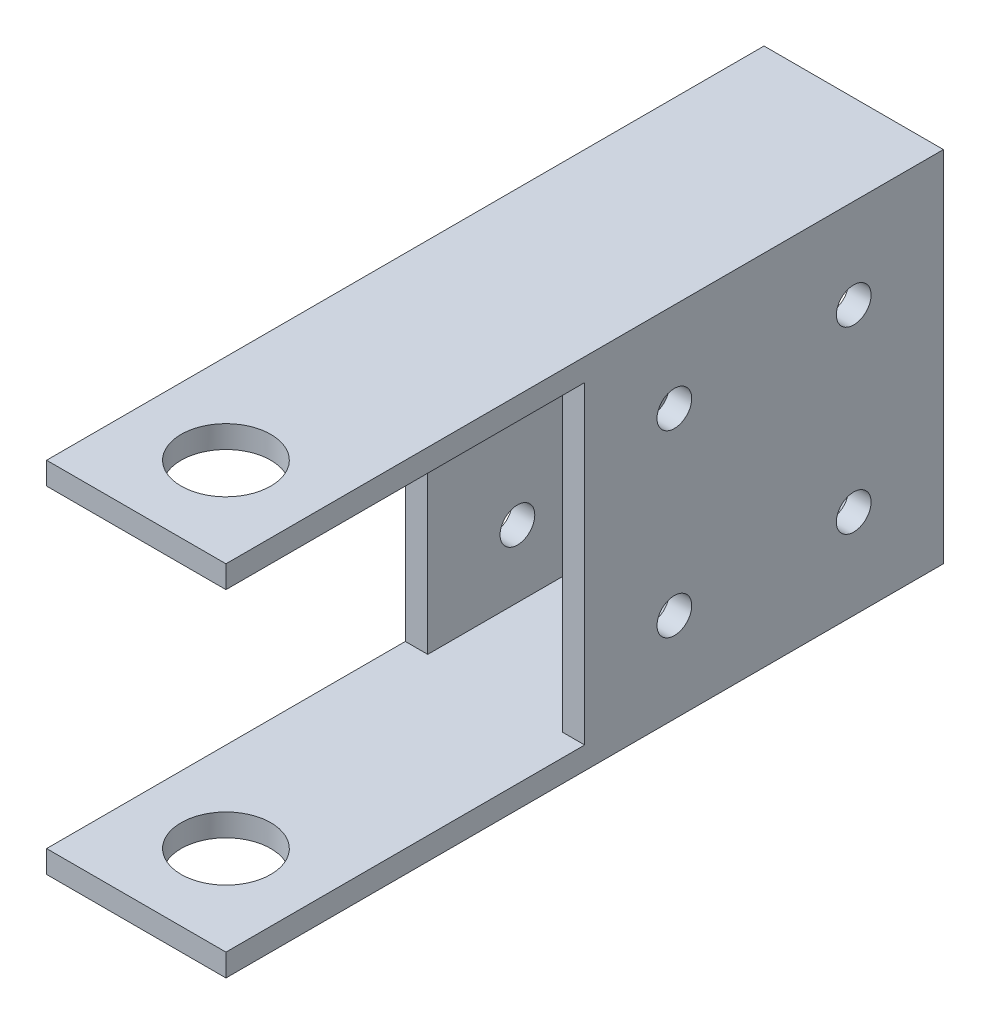
ISO-10303-21;
HEADER;
FILE_DESCRIPTION(('STEP AP214'),'2;1');
FILE_NAME('part.step','',(''),(''),'','','');
FILE_SCHEMA(('AUTOMOTIVE_DESIGN { 1 0 10303 214 1 1 1 1 }'));
ENDSEC;
DATA;
#1=APPLICATION_CONTEXT('core data for automotive mechanical design processes');
#2=APPLICATION_PROTOCOL_DEFINITION('international standard','automotive_design',2000,#1);
#3=PRODUCT_CONTEXT('',#1,'mechanical');
#4=PRODUCT('Part','Part','',(#3));
#5=PRODUCT_RELATED_PRODUCT_CATEGORY('part','',(#4));
#6=PRODUCT_DEFINITION_FORMATION('','',#4);
#7=PRODUCT_DEFINITION_CONTEXT('part definition',#1,'design');
#8=PRODUCT_DEFINITION('design','',#6,#7);
#9=PRODUCT_DEFINITION_SHAPE('','',#8);
#10=(LENGTH_UNIT() NAMED_UNIT(*) SI_UNIT(.MILLI.,.METRE.));
#11=(NAMED_UNIT(*) PLANE_ANGLE_UNIT() SI_UNIT($,.RADIAN.));
#12=(NAMED_UNIT(*) SI_UNIT($,.STERADIAN.) SOLID_ANGLE_UNIT());
#13=UNCERTAINTY_MEASURE_WITH_UNIT(LENGTH_MEASURE(1.E-05),#10,'distance_accuracy_value','');
#14=(GEOMETRIC_REPRESENTATION_CONTEXT(3) GLOBAL_UNCERTAINTY_ASSIGNED_CONTEXT((#13)) GLOBAL_UNIT_ASSIGNED_CONTEXT((#10,
#11,#12)) REPRESENTATION_CONTEXT('',''));
#15=CARTESIAN_POINT('',(0.,0.,0.));
#16=DIRECTION('',(0.,0.,1.));
#17=DIRECTION('',(1.,0.,0.));
#18=AXIS2_PLACEMENT_3D('',#15,#16,#17);
#19=CARTESIAN_POINT('',(-12.7,-22.225,0.));
#20=DIRECTION('',(0.,0.,-1.));
#21=DIRECTION('',(-1.,0.,0.));
#22=AXIS2_PLACEMENT_3D('',#19,#20,#21);
#23=PLANE('',#22);
#24=DIRECTION('',(1.,0.,0.));
#25=VECTOR('',#24,1.);
#26=CARTESIAN_POINT('',(-12.7,-22.225,0.));
#27=LINE('',#26,#25);
#28=CARTESIAN_POINT('',(-12.7,-22.225,0.));
#29=VERTEX_POINT('',#28);
#30=CARTESIAN_POINT('',(-9.525,-22.225,0.));
#31=VERTEX_POINT('',#30);
#32=EDGE_CURVE('E229',#29,#31,#27,.T.);
#33=ORIENTED_EDGE('',*,*,#32,.T.);
#34=DIRECTION('',(0.,1.,0.));
#35=VECTOR('',#34,1.);
#36=CARTESIAN_POINT('',(-9.525,-22.225,0.));
#37=LINE('',#36,#35);
#38=CARTESIAN_POINT('',(-9.52500000000001,22.225,0.));
#39=VERTEX_POINT('',#38);
#40=EDGE_CURVE('E174',#31,#39,#37,.T.);
#41=ORIENTED_EDGE('',*,*,#40,.T.);
#42=DIRECTION('',(1.,0.,0.));
#43=VECTOR('',#42,1.);
#44=CARTESIAN_POINT('',(-12.7,22.225,0.));
#45=LINE('',#44,#43);
#46=CARTESIAN_POINT('',(-12.7,22.225,0.));
#47=VERTEX_POINT('',#46);
#48=EDGE_CURVE('E237',#47,#39,#45,.T.);
#49=ORIENTED_EDGE('',*,*,#48,.F.);
#50=DIRECTION('',(0.,1.,0.));
#51=VECTOR('',#50,1.);
#52=CARTESIAN_POINT('',(-12.7,-22.225,0.));
#53=LINE('',#52,#51);
#54=EDGE_CURVE('E212',#29,#47,#53,.T.);
#55=ORIENTED_EDGE('',*,*,#54,.F.);
#56=EDGE_LOOP('',(#33,#41,#49,#55));
#57=FACE_BOUND('',#56,.T.);
#58=ADVANCED_FACE('F33',(#57),#23,.F.);
#59=CARTESIAN_POINT('',(12.7,-12.7,-38.1));
#60=DIRECTION('',(1.,0.,0.));
#61=DIRECTION('',(0.,0.,-1.));
#62=AXIS2_PLACEMENT_3D('',#59,#60,#61);
#63=CYLINDRICAL_SURFACE('',#62,2.45744999999999);
#64=CARTESIAN_POINT('',(-9.525,-12.7,-38.1));
#65=DIRECTION('',(-1.,0.,0.));
#66=DIRECTION('',(0.,-1.,0.));
#67=AXIS2_PLACEMENT_3D('',#64,#65,#66);
#68=CIRCLE('',#67,2.45744999999999);
#69=CARTESIAN_POINT('',(-9.525,-15.15745,-38.1));
#70=VERTEX_POINT('',#69);
#71=EDGE_CURVE('E171',#70,#70,#68,.F.);
#72=ORIENTED_EDGE('',*,*,#71,.T.);
#73=EDGE_LOOP('',(#72));
#74=FACE_BOUND('',#73,.T.);
#75=CARTESIAN_POINT('',(-12.7,-12.7,-38.1));
#76=DIRECTION('',(1.,0.,0.));
#77=DIRECTION('',(0.,0.,-1.));
#78=AXIS2_PLACEMENT_3D('',#75,#76,#77);
#79=CIRCLE('',#78,2.45744999999999);
#80=CARTESIAN_POINT('',(-12.7,-12.7,-40.55745));
#81=VERTEX_POINT('',#80);
#82=EDGE_CURVE('E198',#81,#81,#79,.T.);
#83=ORIENTED_EDGE('',*,*,#82,.F.);
#84=EDGE_LOOP('',(#83));
#85=FACE_BOUND('',#84,.T.);
#86=ADVANCED_FACE('F345',(#74,#85),#63,.F.);
#87=CARTESIAN_POINT('',(12.7,-12.7,-12.7));
#88=DIRECTION('',(1.,0.,0.));
#89=DIRECTION('',(0.,0.,-1.));
#90=AXIS2_PLACEMENT_3D('',#87,#88,#89);
#91=CYLINDRICAL_SURFACE('',#90,2.45744999999999);
#92=CARTESIAN_POINT('',(-9.525,-12.7,-12.7));
#93=DIRECTION('',(-1.,0.,0.));
#94=DIRECTION('',(0.,-1.,0.));
#95=AXIS2_PLACEMENT_3D('',#92,#93,#94);
#96=CIRCLE('',#95,2.45744999999999);
#97=CARTESIAN_POINT('',(-9.525,-15.15745,-12.7));
#98=VERTEX_POINT('',#97);
#99=EDGE_CURVE('E168',#98,#98,#96,.F.);
#100=ORIENTED_EDGE('',*,*,#99,.T.);
#101=EDGE_LOOP('',(#100));
#102=FACE_BOUND('',#101,.T.);
#103=CARTESIAN_POINT('',(-12.7,-12.7,-12.7));
#104=DIRECTION('',(1.,0.,0.));
#105=DIRECTION('',(0.,0.,-1.));
#106=AXIS2_PLACEMENT_3D('',#103,#104,#105);
#107=CIRCLE('',#106,2.45744999999999);
#108=CARTESIAN_POINT('',(-12.7,-12.7,-15.15745));
#109=VERTEX_POINT('',#108);
#110=EDGE_CURVE('E192',#109,#109,#107,.T.);
#111=ORIENTED_EDGE('',*,*,#110,.F.);
#112=EDGE_LOOP('',(#111));
#113=FACE_BOUND('',#112,.T.);
#114=ADVANCED_FACE('F288',(#102,#113),#91,.F.);
#115=CARTESIAN_POINT('',(12.7,12.7,-38.1));
#116=DIRECTION('',(1.,0.,0.));
#117=DIRECTION('',(0.,0.,-1.));
#118=AXIS2_PLACEMENT_3D('',#115,#116,#117);
#119=CYLINDRICAL_SURFACE('',#118,2.45744999999999);
#120=CARTESIAN_POINT('',(-9.52500000000001,12.7,-38.1));
#121=DIRECTION('',(-1.,0.,0.));
#122=DIRECTION('',(0.,-1.,0.));
#123=AXIS2_PLACEMENT_3D('',#120,#121,#122);
#124=CIRCLE('',#123,2.45744999999999);
#125=CARTESIAN_POINT('',(-9.52500000000001,10.24255,-38.1));
#126=VERTEX_POINT('',#125);
#127=EDGE_CURVE('E165',#126,#126,#124,.F.);
#128=ORIENTED_EDGE('',*,*,#127,.T.);
#129=EDGE_LOOP('',(#128));
#130=FACE_BOUND('',#129,.T.);
#131=CARTESIAN_POINT('',(-12.7,12.7,-38.1));
#132=DIRECTION('',(1.,0.,0.));
#133=DIRECTION('',(0.,0.,-1.));
#134=AXIS2_PLACEMENT_3D('',#131,#132,#133);
#135=CIRCLE('',#134,2.45744999999999);
#136=CARTESIAN_POINT('',(-12.7,12.7,-40.55745));
#137=VERTEX_POINT('',#136);
#138=EDGE_CURVE('E186',#137,#137,#135,.T.);
#139=ORIENTED_EDGE('',*,*,#138,.F.);
#140=EDGE_LOOP('',(#139));
#141=FACE_BOUND('',#140,.T.);
#142=ADVANCED_FACE('F442',(#130,#141),#119,.F.);
#143=CARTESIAN_POINT('',(12.7,12.7,-12.7));
#144=DIRECTION('',(1.,0.,0.));
#145=DIRECTION('',(0.,0.,-1.));
#146=AXIS2_PLACEMENT_3D('',#143,#144,#145);
#147=CYLINDRICAL_SURFACE('',#146,2.45744999999999);
#148=CARTESIAN_POINT('',(-9.52500000000001,12.7,-12.7));
#149=DIRECTION('',(-1.,0.,0.));
#150=DIRECTION('',(0.,-1.,0.));
#151=AXIS2_PLACEMENT_3D('',#148,#149,#150);
#152=CIRCLE('',#151,2.45744999999999);
#153=CARTESIAN_POINT('',(-9.52500000000001,10.24255,-12.7));
#154=VERTEX_POINT('',#153);
#155=EDGE_CURVE('E37',#154,#154,#152,.F.);
#156=ORIENTED_EDGE('',*,*,#155,.T.);
#157=EDGE_LOOP('',(#156));
#158=FACE_BOUND('',#157,.T.);
#159=CARTESIAN_POINT('',(-12.7,12.7,-12.7));
#160=DIRECTION('',(1.,0.,0.));
#161=DIRECTION('',(0.,0.,-1.));
#162=AXIS2_PLACEMENT_3D('',#159,#160,#161);
#163=CIRCLE('',#162,2.45744999999999);
#164=CARTESIAN_POINT('',(-12.7,12.7,-15.15745));
#165=VERTEX_POINT('',#164);
#166=EDGE_CURVE('E180',#165,#165,#163,.T.);
#167=ORIENTED_EDGE('',*,*,#166,.F.);
#168=EDGE_LOOP('',(#167));
#169=FACE_BOUND('',#168,.T.);
#170=ADVANCED_FACE('F451',(#158,#169),#147,.F.);
#171=CARTESIAN_POINT('',(0.,0.,50.8));
#172=DIRECTION('',(0.,0.,1.));
#173=DIRECTION('',(1.,0.,0.));
#174=AXIS2_PLACEMENT_3D('',#171,#172,#173);
#175=PLANE('',#174);
#176=DIRECTION('',(1.,0.,0.));
#177=VECTOR('',#176,1.);
#178=CARTESIAN_POINT('',(-12.7,-22.225,50.8));
#179=LINE('',#178,#177);
#180=CARTESIAN_POINT('',(-12.7,-22.225,50.8));
#181=VERTEX_POINT('',#180);
#182=CARTESIAN_POINT('',(12.7,-22.225,50.8));
#183=VERTEX_POINT('',#182);
#184=EDGE_CURVE('E233',#181,#183,#179,.T.);
#185=ORIENTED_EDGE('',*,*,#184,.F.);
#186=DIRECTION('',(0.,-1.,0.));
#187=VECTOR('',#186,1.);
#188=CARTESIAN_POINT('',(-12.7,25.4,50.8));
#189=LINE('',#188,#187);
#190=CARTESIAN_POINT('',(-12.7,-25.4,50.8));
#191=VERTEX_POINT('',#190);
#192=EDGE_CURVE('E246',#181,#191,#189,.T.);
#193=ORIENTED_EDGE('',*,*,#192,.T.);
#194=DIRECTION('',(1.,0.,0.));
#195=VECTOR('',#194,1.);
#196=CARTESIAN_POINT('',(-12.7,-25.4,50.8));
#197=LINE('',#196,#195);
#198=CARTESIAN_POINT('',(12.7,-25.4,50.8));
#199=VERTEX_POINT('',#198);
#200=EDGE_CURVE('E250',#191,#199,#197,.T.);
#201=ORIENTED_EDGE('',*,*,#200,.T.);
#202=DIRECTION('',(0.,1.,0.));
#203=VECTOR('',#202,1.);
#204=CARTESIAN_POINT('',(12.7,25.4,50.8));
#205=LINE('',#204,#203);
#206=EDGE_CURVE('E240',#199,#183,#205,.T.);
#207=ORIENTED_EDGE('',*,*,#206,.T.);
#208=EDGE_LOOP('',(#185,#193,#201,#207));
#209=FACE_BOUND('',#208,.T.);
#210=ADVANCED_FACE('F294',(#209),#175,.T.);
#211=CARTESIAN_POINT('',(12.7,25.4,50.8));
#212=DIRECTION('',(-1.,0.,0.));
#213=DIRECTION('',(0.,-1.,0.));
#214=AXIS2_PLACEMENT_3D('',#211,#212,#213);
#215=PLANE('',#214);
#216=CARTESIAN_POINT('',(12.7,12.7,-12.7));
#217=DIRECTION('',(1.,0.,0.));
#218=DIRECTION('',(0.,0.,-1.));
#219=AXIS2_PLACEMENT_3D('',#216,#217,#218);
#220=CIRCLE('',#219,2.45744999999999);
#221=CARTESIAN_POINT('',(12.7,12.7,-15.15745));
#222=VERTEX_POINT('',#221);
#223=EDGE_CURVE('E177',#222,#222,#220,.T.);
#224=ORIENTED_EDGE('',*,*,#223,.F.);
#225=EDGE_LOOP('',(#224));
#226=FACE_BOUND('',#225,.T.);
#227=CARTESIAN_POINT('',(12.7,12.7,-38.1));
#228=DIRECTION('',(1.,0.,0.));
#229=DIRECTION('',(0.,0.,-1.));
#230=AXIS2_PLACEMENT_3D('',#227,#228,#229);
#231=CIRCLE('',#230,2.45744999999999);
#232=CARTESIAN_POINT('',(12.7,12.7,-40.55745));
#233=VERTEX_POINT('',#232);
#234=EDGE_CURVE('E183',#233,#233,#231,.T.);
#235=ORIENTED_EDGE('',*,*,#234,.F.);
#236=EDGE_LOOP('',(#235));
#237=FACE_BOUND('',#236,.T.);
#238=CARTESIAN_POINT('',(12.7,-12.7,-12.7));
#239=DIRECTION('',(1.,0.,0.));
#240=DIRECTION('',(0.,0.,-1.));
#241=AXIS2_PLACEMENT_3D('',#238,#239,#240);
#242=CIRCLE('',#241,2.45744999999999);
#243=CARTESIAN_POINT('',(12.7,-12.7,-15.15745));
#244=VERTEX_POINT('',#243);
#245=EDGE_CURVE('E189',#244,#244,#242,.T.);
#246=ORIENTED_EDGE('',*,*,#245,.F.);
#247=EDGE_LOOP('',(#246));
#248=FACE_BOUND('',#247,.T.);
#249=CARTESIAN_POINT('',(12.7,-12.7,-38.1));
#250=DIRECTION('',(1.,0.,0.));
#251=DIRECTION('',(0.,0.,-1.));
#252=AXIS2_PLACEMENT_3D('',#249,#250,#251);
#253=CIRCLE('',#252,2.45744999999999);
#254=CARTESIAN_POINT('',(12.7,-12.7,-40.55745));
#255=VERTEX_POINT('',#254);
#256=EDGE_CURVE('E195',#255,#255,#253,.T.);
#257=ORIENTED_EDGE('',*,*,#256,.F.);
#258=EDGE_LOOP('',(#257));
#259=FACE_BOUND('',#258,.T.);
#260=DIRECTION('',(0.,1.,0.));
#261=VECTOR('',#260,1.);
#262=CARTESIAN_POINT('',(12.7,-22.225,0.));
#263=LINE('',#262,#261);
#264=CARTESIAN_POINT('',(12.7,-22.225,0.));
#265=VERTEX_POINT('',#264);
#266=CARTESIAN_POINT('',(12.7,22.225,0.));
#267=VERTEX_POINT('',#266);
#268=EDGE_CURVE('E211',#265,#267,#263,.T.);
#269=ORIENTED_EDGE('',*,*,#268,.F.);
#270=DIRECTION('',(0.,0.,-1.));
#271=VECTOR('',#270,1.);
#272=CARTESIAN_POINT('',(12.7,-22.225,0.));
#273=LINE('',#272,#271);
#274=EDGE_CURVE('E216',#183,#265,#273,.T.);
#275=ORIENTED_EDGE('',*,*,#274,.F.);
#276=ORIENTED_EDGE('',*,*,#206,.F.);
#277=DIRECTION('',(0.,0.,-1.));
#278=VECTOR('',#277,1.);
#279=CARTESIAN_POINT('',(12.7,-25.4,50.8));
#280=LINE('',#279,#278);
#281=CARTESIAN_POINT('',(12.7,-25.4,-50.8));
#282=VERTEX_POINT('',#281);
#283=EDGE_CURVE('E252',#199,#282,#280,.T.);
#284=ORIENTED_EDGE('',*,*,#283,.T.);
#285=DIRECTION('',(0.,1.,0.));
#286=VECTOR('',#285,1.);
#287=CARTESIAN_POINT('',(12.7,25.4,-50.8));
#288=LINE('',#287,#286);
#289=CARTESIAN_POINT('',(12.7,25.4,-50.8));
#290=VERTEX_POINT('',#289);
#291=EDGE_CURVE('E232',#282,#290,#288,.T.);
#292=ORIENTED_EDGE('',*,*,#291,.T.);
#293=DIRECTION('',(0.,0.,-1.));
#294=VECTOR('',#293,1.);
#295=CARTESIAN_POINT('',(12.7,25.4,50.8));
#296=LINE('',#295,#294);
#297=CARTESIAN_POINT('',(12.7,25.4,50.8));
#298=VERTEX_POINT('',#297);
#299=EDGE_CURVE('E11',#298,#290,#296,.T.);
#300=ORIENTED_EDGE('',*,*,#299,.F.);
#301=CARTESIAN_POINT('',(12.7,22.225,50.8));
#302=VERTEX_POINT('',#301);
#303=EDGE_CURVE('E244',#302,#298,#205,.T.);
#304=ORIENTED_EDGE('',*,*,#303,.F.);
#305=DIRECTION('',(0.,0.,1.));
#306=VECTOR('',#305,1.);
#307=CARTESIAN_POINT('',(12.7,22.225,0.));
#308=LINE('',#307,#306);
#309=EDGE_CURVE('E225',#267,#302,#308,.T.);
#310=ORIENTED_EDGE('',*,*,#309,.F.);
#311=EDGE_LOOP('',(#269,#275,#276,#284,#292,#300,#304,#310));
#312=FACE_BOUND('',#311,.T.);
#313=ADVANCED_FACE('F35',(#226,#237,#248,#259,#312),#215,.F.);
#314=CARTESIAN_POINT('',(-12.7,25.4,50.8));
#315=DIRECTION('',(0.,-1.,0.));
#316=DIRECTION('',(0.,0.,-1.));
#317=AXIS2_PLACEMENT_3D('',#314,#315,#316);
#318=PLANE('',#317);
#319=CARTESIAN_POINT('',(0.,25.4,38.1));
#320=DIRECTION('',(0.,1.,0.));
#321=DIRECTION('',(0.,0.,1.));
#322=AXIS2_PLACEMENT_3D('',#319,#320,#321);
#323=CIRCLE('',#322,6.35);
#324=CARTESIAN_POINT('',(0.,25.4,44.45));
#325=VERTEX_POINT('',#324);
#326=EDGE_CURVE('E201',#325,#325,#323,.T.);
#327=ORIENTED_EDGE('',*,*,#326,.F.);
#328=EDGE_LOOP('',(#327));
#329=FACE_BOUND('',#328,.T.);
#330=DIRECTION('',(-1.,0.,0.));
#331=VECTOR('',#330,1.);
#332=CARTESIAN_POINT('',(-12.7,25.4,-50.8));
#333=LINE('',#332,#331);
#334=CARTESIAN_POINT('',(-12.7,25.4,-50.8));
#335=VERTEX_POINT('',#334);
#336=EDGE_CURVE('E255',#290,#335,#333,.T.);
#337=ORIENTED_EDGE('',*,*,#336,.T.);
#338=DIRECTION('',(0.,0.,-1.));
#339=VECTOR('',#338,1.);
#340=CARTESIAN_POINT('',(-12.7,25.4,50.8));
#341=LINE('',#340,#339);
#342=CARTESIAN_POINT('',(-12.7,25.4,50.8));
#343=VERTEX_POINT('',#342);
#344=EDGE_CURVE('E42',#343,#335,#341,.T.);
#345=ORIENTED_EDGE('',*,*,#344,.F.);
#346=DIRECTION('',(-1.,0.,0.));
#347=VECTOR('',#346,1.);
#348=CARTESIAN_POINT('',(-12.7,25.4,50.8));
#349=LINE('',#348,#347);
#350=EDGE_CURVE('E243',#298,#343,#349,.T.);
#351=ORIENTED_EDGE('',*,*,#350,.F.);
#352=ORIENTED_EDGE('',*,*,#299,.T.);
#353=EDGE_LOOP('',(#337,#345,#351,#352));
#354=FACE_BOUND('',#353,.T.);
#355=ADVANCED_FACE('F293',(#329,#354),#318,.F.);
#356=CARTESIAN_POINT('',(-12.7,25.4,50.8));
#357=DIRECTION('',(1.,0.,0.));
#358=DIRECTION('',(0.,1.,0.));
#359=AXIS2_PLACEMENT_3D('',#356,#357,#358);
#360=PLANE('',#359);
#361=ORIENTED_EDGE('',*,*,#166,.T.);
#362=EDGE_LOOP('',(#361));
#363=FACE_BOUND('',#362,.T.);
#364=ORIENTED_EDGE('',*,*,#138,.T.);
#365=EDGE_LOOP('',(#364));
#366=FACE_BOUND('',#365,.T.);
#367=ORIENTED_EDGE('',*,*,#110,.T.);
#368=EDGE_LOOP('',(#367));
#369=FACE_BOUND('',#368,.T.);
#370=ORIENTED_EDGE('',*,*,#82,.T.);
#371=EDGE_LOOP('',(#370));
#372=FACE_BOUND('',#371,.T.);
#373=ORIENTED_EDGE('',*,*,#192,.F.);
#374=DIRECTION('',(0.,0.,-1.));
#375=VECTOR('',#374,1.);
#376=CARTESIAN_POINT('',(-12.7,-22.225,0.));
#377=LINE('',#376,#375);
#378=EDGE_CURVE('E219',#181,#29,#377,.T.);
#379=ORIENTED_EDGE('',*,*,#378,.T.);
#380=ORIENTED_EDGE('',*,*,#54,.T.);
#381=DIRECTION('',(0.,0.,1.));
#382=VECTOR('',#381,1.);
#383=CARTESIAN_POINT('',(-12.7,22.225,0.));
#384=LINE('',#383,#382);
#385=CARTESIAN_POINT('',(-12.7,22.225,50.8));
#386=VERTEX_POINT('',#385);
#387=EDGE_CURVE('E215',#47,#386,#384,.T.);
#388=ORIENTED_EDGE('',*,*,#387,.T.);
#389=EDGE_CURVE('E247',#343,#386,#189,.T.);
#390=ORIENTED_EDGE('',*,*,#389,.F.);
#391=ORIENTED_EDGE('',*,*,#344,.T.);
#392=DIRECTION('',(0.,-1.,0.));
#393=VECTOR('',#392,1.);
#394=CARTESIAN_POINT('',(-12.7,25.4,-50.8));
#395=LINE('',#394,#393);
#396=CARTESIAN_POINT('',(-12.7,-25.4,-50.8));
#397=VERTEX_POINT('',#396);
#398=EDGE_CURVE('E257',#335,#397,#395,.T.);
#399=ORIENTED_EDGE('',*,*,#398,.T.);
#400=DIRECTION('',(0.,0.,-1.));
#401=VECTOR('',#400,1.);
#402=CARTESIAN_POINT('',(-12.7,-25.4,50.8));
#403=LINE('',#402,#401);
#404=EDGE_CURVE('E263',#191,#397,#403,.T.);
#405=ORIENTED_EDGE('',*,*,#404,.F.);
#406=EDGE_LOOP('',(#373,#379,#380,#388,#390,#391,#399,#405));
#407=FACE_BOUND('',#406,.T.);
#408=ADVANCED_FACE('F311',(#363,#366,#369,#372,#407),#360,.F.);
#409=CARTESIAN_POINT('',(-12.7,-25.4,50.8));
#410=DIRECTION('',(0.,1.,0.));
#411=DIRECTION('',(0.,0.,1.));
#412=AXIS2_PLACEMENT_3D('',#409,#410,#411);
#413=PLANE('',#412);
#414=CARTESIAN_POINT('',(0.,-25.4,38.1));
#415=DIRECTION('',(0.,1.,0.));
#416=DIRECTION('',(0.,0.,1.));
#417=AXIS2_PLACEMENT_3D('',#414,#415,#416);
#418=CIRCLE('',#417,6.35);
#419=CARTESIAN_POINT('',(0.,-25.4,44.45));
#420=VERTEX_POINT('',#419);
#421=EDGE_CURVE('E202',#420,#420,#418,.T.);
#422=ORIENTED_EDGE('',*,*,#421,.T.);
#423=EDGE_LOOP('',(#422));
#424=FACE_BOUND('',#423,.T.);
#425=DIRECTION('',(1.,0.,0.));
#426=VECTOR('',#425,1.);
#427=CARTESIAN_POINT('',(-12.7,-25.4,-50.8));
#428=LINE('',#427,#426);
#429=EDGE_CURVE('E259',#397,#282,#428,.T.);
#430=ORIENTED_EDGE('',*,*,#429,.T.);
#431=ORIENTED_EDGE('',*,*,#283,.F.);
#432=ORIENTED_EDGE('',*,*,#200,.F.);
#433=ORIENTED_EDGE('',*,*,#404,.T.);
#434=EDGE_LOOP('',(#430,#431,#432,#433));
#435=FACE_BOUND('',#434,.T.);
#436=ADVANCED_FACE('F317',(#424,#435),#413,.F.);
#437=DIRECTION('',(1.,0.,0.));
#438=VECTOR('',#437,1.);
#439=CARTESIAN_POINT('',(-12.7,22.225,50.8));
#440=LINE('',#439,#438);
#441=EDGE_CURVE('E235',#386,#302,#440,.T.);
#442=ORIENTED_EDGE('',*,*,#441,.T.);
#443=ORIENTED_EDGE('',*,*,#303,.T.);
#444=ORIENTED_EDGE('',*,*,#350,.T.);
#445=ORIENTED_EDGE('',*,*,#389,.T.);
#446=EDGE_LOOP('',(#442,#443,#444,#445));
#447=FACE_BOUND('',#446,.T.);
#448=ADVANCED_FACE('F324',(#447),#175,.T.);
#449=CARTESIAN_POINT('',(0.,0.,-50.8));
#450=DIRECTION('',(0.,0.,1.));
#451=DIRECTION('',(1.,0.,0.));
#452=AXIS2_PLACEMENT_3D('',#449,#450,#451);
#453=PLANE('',#452);
#454=DIRECTION('',(0.,-1.,0.));
#455=VECTOR('',#454,1.);
#456=CARTESIAN_POINT('',(9.52499999999999,22.225,-50.8));
#457=LINE('',#456,#455);
#458=CARTESIAN_POINT('',(9.52499999999999,22.225,-50.8));
#459=VERTEX_POINT('',#458);
#460=CARTESIAN_POINT('',(9.525,-22.225,-50.8));
#461=VERTEX_POINT('',#460);
#462=EDGE_CURVE('E137',#459,#461,#457,.T.);
#463=ORIENTED_EDGE('',*,*,#462,.F.);
#464=DIRECTION('',(1.,0.,0.));
#465=VECTOR('',#464,1.);
#466=CARTESIAN_POINT('',(-9.52500000000001,22.225,-50.8));
#467=LINE('',#466,#465);
#468=CARTESIAN_POINT('',(-9.52500000000001,22.225,-50.8));
#469=VERTEX_POINT('',#468);
#470=EDGE_CURVE('E50',#469,#459,#467,.T.);
#471=ORIENTED_EDGE('',*,*,#470,.F.);
#472=DIRECTION('',(0.,1.,0.));
#473=VECTOR('',#472,1.);
#474=CARTESIAN_POINT('',(-9.525,-22.225,-50.8));
#475=LINE('',#474,#473);
#476=CARTESIAN_POINT('',(-9.525,-22.225,-50.8));
#477=VERTEX_POINT('',#476);
#478=EDGE_CURVE('E144',#477,#469,#475,.T.);
#479=ORIENTED_EDGE('',*,*,#478,.F.);
#480=DIRECTION('',(-1.,0.,0.));
#481=VECTOR('',#480,1.);
#482=CARTESIAN_POINT('',(9.525,-22.225,-50.8));
#483=LINE('',#482,#481);
#484=EDGE_CURVE('E129',#461,#477,#483,.T.);
#485=ORIENTED_EDGE('',*,*,#484,.F.);
#486=EDGE_LOOP('',(#463,#471,#479,#485));
#487=FACE_BOUND('',#486,.T.);
#488=ORIENTED_EDGE('',*,*,#291,.F.);
#489=ORIENTED_EDGE('',*,*,#429,.F.);
#490=ORIENTED_EDGE('',*,*,#398,.F.);
#491=ORIENTED_EDGE('',*,*,#336,.F.);
#492=EDGE_LOOP('',(#488,#489,#490,#491));
#493=FACE_BOUND('',#492,.T.);
#494=ADVANCED_FACE('F141',(#487,#493),#453,.F.);
#495=CARTESIAN_POINT('',(9.52499999999999,22.225,0.));
#496=VERTEX_POINT('',#495);
#497=EDGE_CURVE('E222',#496,#267,#45,.T.);
#498=ORIENTED_EDGE('',*,*,#497,.F.);
#499=DIRECTION('',(0.,-1.,0.));
#500=VECTOR('',#499,1.);
#501=CARTESIAN_POINT('',(9.525,-22.225,0.));
#502=LINE('',#501,#500);
#503=CARTESIAN_POINT('',(9.525,-22.225,0.));
#504=VERTEX_POINT('',#503);
#505=EDGE_CURVE('E163',#496,#504,#502,.T.);
#506=ORIENTED_EDGE('',*,*,#505,.T.);
#507=EDGE_CURVE('E132',#504,#265,#27,.T.);
#508=ORIENTED_EDGE('',*,*,#507,.T.);
#509=ORIENTED_EDGE('',*,*,#268,.T.);
#510=EDGE_LOOP('',(#498,#506,#508,#509));
#511=FACE_BOUND('',#510,.T.);
#512=ADVANCED_FACE('F305',(#511),#23,.F.);
#513=CARTESIAN_POINT('',(-12.7,-22.225,0.));
#514=DIRECTION('',(0.,-1.,0.));
#515=DIRECTION('',(1.,0.,0.));
#516=AXIS2_PLACEMENT_3D('',#513,#514,#515);
#517=PLANE('',#516);
#518=ORIENTED_EDGE('',*,*,#507,.F.);
#519=DIRECTION('',(0.,0.,-1.));
#520=VECTOR('',#519,1.);
#521=CARTESIAN_POINT('',(9.525,-22.225,50.8));
#522=LINE('',#521,#520);
#523=EDGE_CURVE('E58',#504,#461,#522,.T.);
#524=ORIENTED_EDGE('',*,*,#523,.T.);
#525=ORIENTED_EDGE('',*,*,#484,.T.);
#526=DIRECTION('',(0.,0.,-1.));
#527=VECTOR('',#526,1.);
#528=CARTESIAN_POINT('',(-9.525,-22.225,50.8));
#529=LINE('',#528,#527);
#530=EDGE_CURVE('E133',#31,#477,#529,.T.);
#531=ORIENTED_EDGE('',*,*,#530,.F.);
#532=ORIENTED_EDGE('',*,*,#32,.F.);
#533=ORIENTED_EDGE('',*,*,#378,.F.);
#534=ORIENTED_EDGE('',*,*,#184,.T.);
#535=ORIENTED_EDGE('',*,*,#274,.T.);
#536=EDGE_LOOP('',(#518,#524,#525,#531,#532,#533,#534,#535));
#537=FACE_BOUND('',#536,.T.);
#538=CARTESIAN_POINT('',(0.,-22.225,38.1));
#539=DIRECTION('',(0.,-1.,0.));
#540=DIRECTION('',(1.,0.,0.));
#541=AXIS2_PLACEMENT_3D('',#538,#539,#540);
#542=CIRCLE('',#541,6.35);
#543=CARTESIAN_POINT('',(6.35,-22.225,38.1));
#544=VERTEX_POINT('',#543);
#545=EDGE_CURVE('E208',#544,#544,#542,.T.);
#546=ORIENTED_EDGE('',*,*,#545,.T.);
#547=EDGE_LOOP('',(#546));
#548=FACE_BOUND('',#547,.T.);
#549=ADVANCED_FACE('F125',(#537,#548),#517,.F.);
#550=CARTESIAN_POINT('',(-12.7,22.225,0.));
#551=DIRECTION('',(0.,1.,0.));
#552=DIRECTION('',(-1.,0.,0.));
#553=AXIS2_PLACEMENT_3D('',#550,#551,#552);
#554=PLANE('',#553);
#555=ORIENTED_EDGE('',*,*,#309,.T.);
#556=ORIENTED_EDGE('',*,*,#441,.F.);
#557=ORIENTED_EDGE('',*,*,#387,.F.);
#558=ORIENTED_EDGE('',*,*,#48,.T.);
#559=DIRECTION('',(0.,0.,-1.));
#560=VECTOR('',#559,1.);
#561=CARTESIAN_POINT('',(-9.52500000000001,22.225,50.8));
#562=LINE('',#561,#560);
#563=EDGE_CURVE('E149',#39,#469,#562,.T.);
#564=ORIENTED_EDGE('',*,*,#563,.T.);
#565=ORIENTED_EDGE('',*,*,#470,.T.);
#566=DIRECTION('',(0.,0.,-1.));
#567=VECTOR('',#566,1.);
#568=CARTESIAN_POINT('',(9.52499999999999,22.225,50.8));
#569=LINE('',#568,#567);
#570=EDGE_CURVE('E134',#496,#459,#569,.T.);
#571=ORIENTED_EDGE('',*,*,#570,.F.);
#572=ORIENTED_EDGE('',*,*,#497,.T.);
#573=EDGE_LOOP('',(#555,#556,#557,#558,#564,#565,#571,#572));
#574=FACE_BOUND('',#573,.T.);
#575=CARTESIAN_POINT('',(0.,22.225,38.1));
#576=DIRECTION('',(0.,1.,0.));
#577=DIRECTION('',(-1.,0.,0.));
#578=AXIS2_PLACEMENT_3D('',#575,#576,#577);
#579=CIRCLE('',#578,6.35);
#580=CARTESIAN_POINT('',(-6.35,22.225,38.1));
#581=VERTEX_POINT('',#580);
#582=EDGE_CURVE('E205',#581,#581,#579,.T.);
#583=ORIENTED_EDGE('',*,*,#582,.T.);
#584=EDGE_LOOP('',(#583));
#585=FACE_BOUND('',#584,.T.);
#586=ADVANCED_FACE('F327',(#574,#585),#554,.F.);
#587=CARTESIAN_POINT('',(0.,-25.4,38.1));
#588=DIRECTION('',(0.,1.,0.));
#589=DIRECTION('',(0.,0.,1.));
#590=AXIS2_PLACEMENT_3D('',#587,#588,#589);
#591=CYLINDRICAL_SURFACE('',#590,6.35);
#592=ORIENTED_EDGE('',*,*,#326,.T.);
#593=EDGE_LOOP('',(#592));
#594=FACE_BOUND('',#593,.T.);
#595=ORIENTED_EDGE('',*,*,#582,.F.);
#596=EDGE_LOOP('',(#595));
#597=FACE_BOUND('',#596,.T.);
#598=ADVANCED_FACE('F330',(#594,#597),#591,.F.);
#599=ORIENTED_EDGE('',*,*,#421,.F.);
#600=EDGE_LOOP('',(#599));
#601=FACE_BOUND('',#600,.T.);
#602=ORIENTED_EDGE('',*,*,#545,.F.);
#603=EDGE_LOOP('',(#602));
#604=FACE_BOUND('',#603,.T.);
#605=ADVANCED_FACE('F335',(#601,#604),#591,.F.);
#606=CARTESIAN_POINT('',(9.525,-12.7,-38.1));
#607=DIRECTION('',(1.,0.,0.));
#608=DIRECTION('',(0.,1.,0.));
#609=AXIS2_PLACEMENT_3D('',#606,#607,#608);
#610=CIRCLE('',#609,2.45744999999999);
#611=CARTESIAN_POINT('',(9.525,-10.24255,-38.1));
#612=VERTEX_POINT('',#611);
#613=EDGE_CURVE('E160',#612,#612,#610,.F.);
#614=ORIENTED_EDGE('',*,*,#613,.T.);
#615=EDGE_LOOP('',(#614));
#616=FACE_BOUND('',#615,.T.);
#617=ORIENTED_EDGE('',*,*,#256,.T.);
#618=EDGE_LOOP('',(#617));
#619=FACE_BOUND('',#618,.T.);
#620=ADVANCED_FACE('F286',(#616,#619),#63,.F.);
#621=CARTESIAN_POINT('',(9.525,-12.7,-12.7));
#622=DIRECTION('',(1.,0.,0.));
#623=DIRECTION('',(0.,1.,0.));
#624=AXIS2_PLACEMENT_3D('',#621,#622,#623);
#625=CIRCLE('',#624,2.45744999999999);
#626=CARTESIAN_POINT('',(9.525,-10.24255,-12.7));
#627=VERTEX_POINT('',#626);
#628=EDGE_CURVE('E157',#627,#627,#625,.F.);
#629=ORIENTED_EDGE('',*,*,#628,.T.);
#630=EDGE_LOOP('',(#629));
#631=FACE_BOUND('',#630,.T.);
#632=ORIENTED_EDGE('',*,*,#245,.T.);
#633=EDGE_LOOP('',(#632));
#634=FACE_BOUND('',#633,.T.);
#635=ADVANCED_FACE('F282',(#631,#634),#91,.F.);
#636=CARTESIAN_POINT('',(9.52499999999999,12.7,-38.1));
#637=DIRECTION('',(1.,0.,0.));
#638=DIRECTION('',(0.,1.,0.));
#639=AXIS2_PLACEMENT_3D('',#636,#637,#638);
#640=CIRCLE('',#639,2.45744999999999);
#641=CARTESIAN_POINT('',(9.52499999999999,15.15745,-38.1));
#642=VERTEX_POINT('',#641);
#643=EDGE_CURVE('E154',#642,#642,#640,.F.);
#644=ORIENTED_EDGE('',*,*,#643,.T.);
#645=EDGE_LOOP('',(#644));
#646=FACE_BOUND('',#645,.T.);
#647=ORIENTED_EDGE('',*,*,#234,.T.);
#648=EDGE_LOOP('',(#647));
#649=FACE_BOUND('',#648,.T.);
#650=ADVANCED_FACE('F285',(#646,#649),#119,.F.);
#651=CARTESIAN_POINT('',(9.52499999999999,12.7,-12.7));
#652=DIRECTION('',(1.,0.,0.));
#653=DIRECTION('',(0.,1.,0.));
#654=AXIS2_PLACEMENT_3D('',#651,#652,#653);
#655=CIRCLE('',#654,2.45744999999999);
#656=CARTESIAN_POINT('',(9.52499999999999,15.15745,-12.7));
#657=VERTEX_POINT('',#656);
#658=EDGE_CURVE('E151',#657,#657,#655,.F.);
#659=ORIENTED_EDGE('',*,*,#658,.T.);
#660=EDGE_LOOP('',(#659));
#661=FACE_BOUND('',#660,.T.);
#662=ORIENTED_EDGE('',*,*,#223,.T.);
#663=EDGE_LOOP('',(#662));
#664=FACE_BOUND('',#663,.T.);
#665=ADVANCED_FACE('F272',(#661,#664),#147,.F.);
#666=CARTESIAN_POINT('',(-9.525,-22.225,50.8));
#667=DIRECTION('',(-1.,0.,0.));
#668=DIRECTION('',(0.,-1.,0.));
#669=AXIS2_PLACEMENT_3D('',#666,#667,#668);
#670=PLANE('',#669);
#671=ORIENTED_EDGE('',*,*,#71,.F.);
#672=EDGE_LOOP('',(#671));
#673=FACE_BOUND('',#672,.T.);
#674=ORIENTED_EDGE('',*,*,#127,.F.);
#675=EDGE_LOOP('',(#674));
#676=FACE_BOUND('',#675,.T.);
#677=ORIENTED_EDGE('',*,*,#155,.F.);
#678=EDGE_LOOP('',(#677));
#679=FACE_BOUND('',#678,.T.);
#680=ORIENTED_EDGE('',*,*,#99,.F.);
#681=EDGE_LOOP('',(#680));
#682=FACE_BOUND('',#681,.T.);
#683=ORIENTED_EDGE('',*,*,#530,.T.);
#684=ORIENTED_EDGE('',*,*,#478,.T.);
#685=ORIENTED_EDGE('',*,*,#563,.F.);
#686=ORIENTED_EDGE('',*,*,#40,.F.);
#687=EDGE_LOOP('',(#683,#684,#685,#686));
#688=FACE_BOUND('',#687,.T.);
#689=ADVANCED_FACE('F277',(#673,#676,#679,#682,#688),#670,.F.);
#690=CARTESIAN_POINT('',(9.52499999999999,22.225,50.8));
#691=DIRECTION('',(1.,0.,0.));
#692=DIRECTION('',(0.,1.,0.));
#693=AXIS2_PLACEMENT_3D('',#690,#691,#692);
#694=PLANE('',#693);
#695=ORIENTED_EDGE('',*,*,#613,.F.);
#696=EDGE_LOOP('',(#695));
#697=FACE_BOUND('',#696,.T.);
#698=ORIENTED_EDGE('',*,*,#643,.F.);
#699=EDGE_LOOP('',(#698));
#700=FACE_BOUND('',#699,.T.);
#701=ORIENTED_EDGE('',*,*,#658,.F.);
#702=EDGE_LOOP('',(#701));
#703=FACE_BOUND('',#702,.T.);
#704=ORIENTED_EDGE('',*,*,#628,.F.);
#705=EDGE_LOOP('',(#704));
#706=FACE_BOUND('',#705,.T.);
#707=ORIENTED_EDGE('',*,*,#570,.T.);
#708=ORIENTED_EDGE('',*,*,#462,.T.);
#709=ORIENTED_EDGE('',*,*,#523,.F.);
#710=ORIENTED_EDGE('',*,*,#505,.F.);
#711=EDGE_LOOP('',(#707,#708,#709,#710));
#712=FACE_BOUND('',#711,.T.);
#713=ADVANCED_FACE('F138',(#697,#700,#703,#706,#712),#694,.F.);
#714=CLOSED_SHELL('',(#58,#86,#114,#142,#170,#210,#313,#355,#408,#436,#448,#494,#512,#549,#586,
#598,#605,#620,#635,#650,#665,#689,#713));
#715=MANIFOLD_SOLID_BREP('B2',#714);
#716=ADVANCED_BREP_SHAPE_REPRESENTATION('',(#18,#715),#14);
#717=SHAPE_DEFINITION_REPRESENTATION(#9,#716);
ENDSEC;
END-ISO-10303-21;
